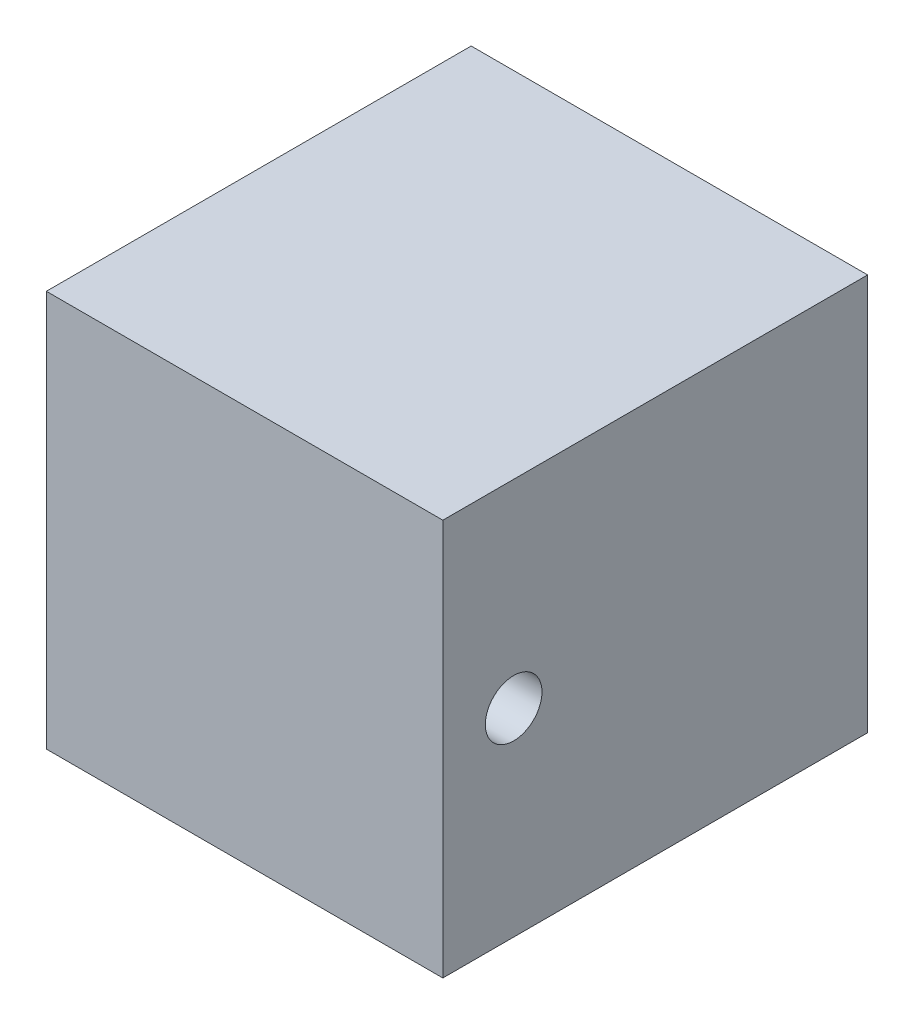
ISO-10303-21;
HEADER;
FILE_DESCRIPTION(('STEP AP214'),'2;1');
FILE_NAME('part.step','',(''),(''),'','','');
FILE_SCHEMA(('AUTOMOTIVE_DESIGN { 1 0 10303 214 1 1 1 1 }'));
ENDSEC;
DATA;
#1=APPLICATION_CONTEXT('core data for automotive mechanical design processes');
#2=APPLICATION_PROTOCOL_DEFINITION('international standard','automotive_design',2000,#1);
#3=PRODUCT_CONTEXT('',#1,'mechanical');
#4=PRODUCT('Part','Part','',(#3));
#5=PRODUCT_RELATED_PRODUCT_CATEGORY('part','',(#4));
#6=PRODUCT_DEFINITION_FORMATION('','',#4);
#7=PRODUCT_DEFINITION_CONTEXT('part definition',#1,'design');
#8=PRODUCT_DEFINITION('design','',#6,#7);
#9=PRODUCT_DEFINITION_SHAPE('','',#8);
#10=(LENGTH_UNIT() NAMED_UNIT(*) SI_UNIT(.MILLI.,.METRE.));
#11=(NAMED_UNIT(*) PLANE_ANGLE_UNIT() SI_UNIT($,.RADIAN.));
#12=(NAMED_UNIT(*) SI_UNIT($,.STERADIAN.) SOLID_ANGLE_UNIT());
#13=UNCERTAINTY_MEASURE_WITH_UNIT(LENGTH_MEASURE(1.E-05),#10,'distance_accuracy_value','');
#14=(GEOMETRIC_REPRESENTATION_CONTEXT(3) GLOBAL_UNCERTAINTY_ASSIGNED_CONTEXT((#13)) GLOBAL_UNIT_ASSIGNED_CONTEXT((#10,
#11,#12)) REPRESENTATION_CONTEXT('',''));
#15=CARTESIAN_POINT('',(0.,0.,0.));
#16=DIRECTION('',(0.,0.,1.));
#17=DIRECTION('',(1.,0.,0.));
#18=AXIS2_PLACEMENT_3D('',#15,#16,#17);
#19=CARTESIAN_POINT('',(0.,0.,0.));
#20=DIRECTION('',(0.,0.,-1.));
#21=DIRECTION('',(-1.,0.,0.));
#22=AXIS2_PLACEMENT_3D('',#19,#20,#21);
#23=PLANE('',#22);
#24=DIRECTION('',(0.,-1.,0.));
#25=VECTOR('',#24,1.);
#26=CARTESIAN_POINT('',(0.,0.,0.));
#27=LINE('',#26,#25);
#28=CARTESIAN_POINT('',(0.,14.,0.));
#29=VERTEX_POINT('',#28);
#30=CARTESIAN_POINT('',(0.,0.,0.));
#31=VERTEX_POINT('',#30);
#32=EDGE_CURVE('E112',#29,#31,#27,.T.);
#33=ORIENTED_EDGE('',*,*,#32,.F.);
#34=DIRECTION('',(-1.,0.,0.));
#35=VECTOR('',#34,1.);
#36=CARTESIAN_POINT('',(0.,14.,0.));
#37=LINE('',#36,#35);
#38=CARTESIAN_POINT('',(14.,14.,0.));
#39=VERTEX_POINT('',#38);
#40=EDGE_CURVE('E63',#39,#29,#37,.T.);
#41=ORIENTED_EDGE('',*,*,#40,.F.);
#42=DIRECTION('',(0.,1.,0.));
#43=VECTOR('',#42,1.);
#44=CARTESIAN_POINT('',(14.,0.,0.));
#45=LINE('',#44,#43);
#46=CARTESIAN_POINT('',(14.,0.,0.));
#47=VERTEX_POINT('',#46);
#48=EDGE_CURVE('E188',#47,#39,#45,.T.);
#49=ORIENTED_EDGE('',*,*,#48,.F.);
#50=DIRECTION('',(1.,0.,0.));
#51=VECTOR('',#50,1.);
#52=CARTESIAN_POINT('',(0.,0.,0.));
#53=LINE('',#52,#51);
#54=EDGE_CURVE('E185',#31,#47,#53,.T.);
#55=ORIENTED_EDGE('',*,*,#54,.F.);
#56=EDGE_LOOP('',(#33,#41,#49,#55));
#57=FACE_BOUND('',#56,.T.);
#58=DIRECTION('',(-1.,0.,0.));
#59=VECTOR('',#58,1.);
#60=CARTESIAN_POINT('',(1.,13.,0.));
#61=LINE('',#60,#59);
#62=CARTESIAN_POINT('',(13.,13.,0.));
#63=VERTEX_POINT('',#62);
#64=CARTESIAN_POINT('',(1.,13.,0.));
#65=VERTEX_POINT('',#64);
#66=EDGE_CURVE('E146',#63,#65,#61,.T.);
#67=ORIENTED_EDGE('',*,*,#66,.T.);
#68=DIRECTION('',(0.,-1.,0.));
#69=VECTOR('',#68,1.);
#70=CARTESIAN_POINT('',(1.,1.,0.));
#71=LINE('',#70,#69);
#72=CARTESIAN_POINT('',(1.,1.,0.));
#73=VERTEX_POINT('',#72);
#74=EDGE_CURVE('E55',#65,#73,#71,.T.);
#75=ORIENTED_EDGE('',*,*,#74,.T.);
#76=DIRECTION('',(1.,0.,0.));
#77=VECTOR('',#76,1.);
#78=CARTESIAN_POINT('',(1.,1.,0.));
#79=LINE('',#78,#77);
#80=CARTESIAN_POINT('',(13.,1.,0.));
#81=VERTEX_POINT('',#80);
#82=EDGE_CURVE('E161',#73,#81,#79,.T.);
#83=ORIENTED_EDGE('',*,*,#82,.T.);
#84=DIRECTION('',(0.,1.,0.));
#85=VECTOR('',#84,1.);
#86=CARTESIAN_POINT('',(13.,1.,0.));
#87=LINE('',#86,#85);
#88=EDGE_CURVE('E165',#81,#63,#87,.T.);
#89=ORIENTED_EDGE('',*,*,#88,.T.);
#90=EDGE_LOOP('',(#67,#75,#83,#89));
#91=FACE_BOUND('',#90,.T.);
#92=ADVANCED_FACE('F39',(#57,#91),#23,.T.);
#93=CARTESIAN_POINT('',(0.,0.,10.));
#94=DIRECTION('',(1.,0.,0.));
#95=DIRECTION('',(0.,0.,-1.));
#96=AXIS2_PLACEMENT_3D('',#93,#94,#95);
#97=PLANE('',#96);
#98=CARTESIAN_POINT('',(0.,7.,12.5));
#99=DIRECTION('',(1.,0.,0.));
#100=DIRECTION('',(0.,0.,-1.));
#101=AXIS2_PLACEMENT_3D('',#98,#99,#100);
#102=CIRCLE('',#101,1.);
#103=CARTESIAN_POINT('',(0.,7.,11.5));
#104=VERTEX_POINT('',#103);
#105=EDGE_CURVE('E129',#104,#104,#102,.T.);
#106=ORIENTED_EDGE('',*,*,#105,.T.);
#107=EDGE_LOOP('',(#106));
#108=FACE_BOUND('',#107,.T.);
#109=ORIENTED_EDGE('',*,*,#32,.T.);
#110=DIRECTION('',(0.,0.,-1.));
#111=VECTOR('',#110,1.);
#112=CARTESIAN_POINT('',(0.,0.,10.));
#113=LINE('',#112,#111);
#114=CARTESIAN_POINT('',(0.,0.,15.));
#115=VERTEX_POINT('',#114);
#116=EDGE_CURVE('E11',#115,#31,#113,.T.);
#117=ORIENTED_EDGE('',*,*,#116,.F.);
#118=DIRECTION('',(0.,-1.,0.));
#119=VECTOR('',#118,1.);
#120=CARTESIAN_POINT('',(0.,14.,15.));
#121=LINE('',#120,#119);
#122=CARTESIAN_POINT('',(0.,14.,15.));
#123=VERTEX_POINT('',#122);
#124=EDGE_CURVE('E110',#123,#115,#121,.T.);
#125=ORIENTED_EDGE('',*,*,#124,.F.);
#126=DIRECTION('',(0.,0.,-1.));
#127=VECTOR('',#126,1.);
#128=CARTESIAN_POINT('',(0.,14.,10.));
#129=LINE('',#128,#127);
#130=EDGE_CURVE('E193',#123,#29,#129,.T.);
#131=ORIENTED_EDGE('',*,*,#130,.T.);
#132=EDGE_LOOP('',(#109,#117,#125,#131));
#133=FACE_BOUND('',#132,.T.);
#134=ADVANCED_FACE('F41',(#108,#133),#97,.F.);
#135=CARTESIAN_POINT('',(0.,0.,10.));
#136=DIRECTION('',(0.,1.,0.));
#137=DIRECTION('',(0.,0.,1.));
#138=AXIS2_PLACEMENT_3D('',#135,#136,#137);
#139=PLANE('',#138);
#140=ORIENTED_EDGE('',*,*,#54,.T.);
#141=DIRECTION('',(0.,0.,-1.));
#142=VECTOR('',#141,1.);
#143=CARTESIAN_POINT('',(14.,0.,10.));
#144=LINE('',#143,#142);
#145=CARTESIAN_POINT('',(14.,0.,15.));
#146=VERTEX_POINT('',#145);
#147=EDGE_CURVE('E48',#146,#47,#144,.T.);
#148=ORIENTED_EDGE('',*,*,#147,.F.);
#149=DIRECTION('',(1.,0.,0.));
#150=VECTOR('',#149,1.);
#151=CARTESIAN_POINT('',(0.,0.,15.));
#152=LINE('',#151,#150);
#153=EDGE_CURVE('E115',#115,#146,#152,.T.);
#154=ORIENTED_EDGE('',*,*,#153,.F.);
#155=ORIENTED_EDGE('',*,*,#116,.T.);
#156=EDGE_LOOP('',(#140,#148,#154,#155));
#157=FACE_BOUND('',#156,.T.);
#158=ADVANCED_FACE('F116',(#157),#139,.F.);
#159=CARTESIAN_POINT('',(14.,0.,10.));
#160=DIRECTION('',(-1.,0.,0.));
#161=DIRECTION('',(0.,0.,1.));
#162=AXIS2_PLACEMENT_3D('',#159,#160,#161);
#163=PLANE('',#162);
#164=CARTESIAN_POINT('',(14.,7.,12.5));
#165=DIRECTION('',(1.,0.,0.));
#166=DIRECTION('',(0.,0.,-1.));
#167=AXIS2_PLACEMENT_3D('',#164,#165,#166);
#168=CIRCLE('',#167,1.);
#169=CARTESIAN_POINT('',(14.,7.,11.5));
#170=VERTEX_POINT('',#169);
#171=EDGE_CURVE('E133',#170,#170,#168,.T.);
#172=ORIENTED_EDGE('',*,*,#171,.F.);
#173=EDGE_LOOP('',(#172));
#174=FACE_BOUND('',#173,.T.);
#175=ORIENTED_EDGE('',*,*,#48,.T.);
#176=DIRECTION('',(0.,0.,-1.));
#177=VECTOR('',#176,1.);
#178=CARTESIAN_POINT('',(14.,14.,10.));
#179=LINE('',#178,#177);
#180=CARTESIAN_POINT('',(14.,14.,15.));
#181=VERTEX_POINT('',#180);
#182=EDGE_CURVE('E196',#181,#39,#179,.T.);
#183=ORIENTED_EDGE('',*,*,#182,.F.);
#184=DIRECTION('',(0.,1.,0.));
#185=VECTOR('',#184,1.);
#186=CARTESIAN_POINT('',(14.,14.,15.));
#187=LINE('',#186,#185);
#188=EDGE_CURVE('E122',#146,#181,#187,.T.);
#189=ORIENTED_EDGE('',*,*,#188,.F.);
#190=ORIENTED_EDGE('',*,*,#147,.T.);
#191=EDGE_LOOP('',(#175,#183,#189,#190));
#192=FACE_BOUND('',#191,.T.);
#193=ADVANCED_FACE('F201',(#174,#192),#163,.F.);
#194=CARTESIAN_POINT('',(0.,14.,10.));
#195=DIRECTION('',(0.,-1.,0.));
#196=DIRECTION('',(0.,0.,-1.));
#197=AXIS2_PLACEMENT_3D('',#194,#195,#196);
#198=PLANE('',#197);
#199=ORIENTED_EDGE('',*,*,#40,.T.);
#200=ORIENTED_EDGE('',*,*,#130,.F.);
#201=DIRECTION('',(-1.,0.,0.));
#202=VECTOR('',#201,1.);
#203=CARTESIAN_POINT('',(0.,14.,15.));
#204=LINE('',#203,#202);
#205=EDGE_CURVE('E127',#181,#123,#204,.T.);
#206=ORIENTED_EDGE('',*,*,#205,.F.);
#207=ORIENTED_EDGE('',*,*,#182,.T.);
#208=EDGE_LOOP('',(#199,#200,#206,#207));
#209=FACE_BOUND('',#208,.T.);
#210=ADVANCED_FACE('F236',(#209),#198,.F.);
#211=CARTESIAN_POINT('',(1.,1.,10.));
#212=DIRECTION('',(1.,0.,0.));
#213=DIRECTION('',(0.,0.,-1.));
#214=AXIS2_PLACEMENT_3D('',#211,#212,#213);
#215=PLANE('',#214);
#216=ORIENTED_EDGE('',*,*,#74,.F.);
#217=DIRECTION('',(0.,0.,-1.));
#218=VECTOR('',#217,1.);
#219=CARTESIAN_POINT('',(1.,13.,10.));
#220=LINE('',#219,#218);
#221=CARTESIAN_POINT('',(1.,13.,10.));
#222=VERTEX_POINT('',#221);
#223=EDGE_CURVE('E158',#222,#65,#220,.T.);
#224=ORIENTED_EDGE('',*,*,#223,.F.);
#225=DIRECTION('',(0.,-1.,0.));
#226=VECTOR('',#225,1.);
#227=CARTESIAN_POINT('',(1.,1.,10.));
#228=LINE('',#227,#226);
#229=CARTESIAN_POINT('',(1.,1.,10.));
#230=VERTEX_POINT('',#229);
#231=EDGE_CURVE('E141',#222,#230,#228,.T.);
#232=ORIENTED_EDGE('',*,*,#231,.T.);
#233=DIRECTION('',(0.,0.,-1.));
#234=VECTOR('',#233,1.);
#235=CARTESIAN_POINT('',(1.,1.,10.));
#236=LINE('',#235,#234);
#237=EDGE_CURVE('E180',#230,#73,#236,.T.);
#238=ORIENTED_EDGE('',*,*,#237,.T.);
#239=EDGE_LOOP('',(#216,#224,#232,#238));
#240=FACE_BOUND('',#239,.T.);
#241=ADVANCED_FACE('F211',(#240),#215,.T.);
#242=CARTESIAN_POINT('',(1.,1.,10.));
#243=DIRECTION('',(0.,1.,0.));
#244=DIRECTION('',(0.,0.,1.));
#245=AXIS2_PLACEMENT_3D('',#242,#243,#244);
#246=PLANE('',#245);
#247=ORIENTED_EDGE('',*,*,#82,.F.);
#248=ORIENTED_EDGE('',*,*,#237,.F.);
#249=DIRECTION('',(1.,0.,0.));
#250=VECTOR('',#249,1.);
#251=CARTESIAN_POINT('',(1.,1.,10.));
#252=LINE('',#251,#250);
#253=CARTESIAN_POINT('',(13.,1.,10.));
#254=VERTEX_POINT('',#253);
#255=EDGE_CURVE('E145',#230,#254,#252,.T.);
#256=ORIENTED_EDGE('',*,*,#255,.T.);
#257=DIRECTION('',(0.,0.,-1.));
#258=VECTOR('',#257,1.);
#259=CARTESIAN_POINT('',(13.,1.,10.));
#260=LINE('',#259,#258);
#261=EDGE_CURVE('E177',#254,#81,#260,.T.);
#262=ORIENTED_EDGE('',*,*,#261,.T.);
#263=EDGE_LOOP('',(#247,#248,#256,#262));
#264=FACE_BOUND('',#263,.T.);
#265=ADVANCED_FACE('F215',(#264),#246,.T.);
#266=CARTESIAN_POINT('',(13.,1.,10.));
#267=DIRECTION('',(-1.,0.,0.));
#268=DIRECTION('',(0.,-1.,0.));
#269=AXIS2_PLACEMENT_3D('',#266,#267,#268);
#270=PLANE('',#269);
#271=ORIENTED_EDGE('',*,*,#88,.F.);
#272=ORIENTED_EDGE('',*,*,#261,.F.);
#273=DIRECTION('',(0.,1.,0.));
#274=VECTOR('',#273,1.);
#275=CARTESIAN_POINT('',(13.,1.,10.));
#276=LINE('',#275,#274);
#277=CARTESIAN_POINT('',(13.,13.,10.));
#278=VERTEX_POINT('',#277);
#279=EDGE_CURVE('E150',#254,#278,#276,.T.);
#280=ORIENTED_EDGE('',*,*,#279,.T.);
#281=DIRECTION('',(0.,0.,-1.));
#282=VECTOR('',#281,1.);
#283=CARTESIAN_POINT('',(13.,13.,10.));
#284=LINE('',#283,#282);
#285=EDGE_CURVE('E174',#278,#63,#284,.T.);
#286=ORIENTED_EDGE('',*,*,#285,.T.);
#287=EDGE_LOOP('',(#271,#272,#280,#286));
#288=FACE_BOUND('',#287,.T.);
#289=ADVANCED_FACE('F218',(#288),#270,.T.);
#290=CARTESIAN_POINT('',(1.,13.,10.));
#291=DIRECTION('',(0.,-1.,0.));
#292=DIRECTION('',(0.,0.,-1.));
#293=AXIS2_PLACEMENT_3D('',#290,#291,#292);
#294=PLANE('',#293);
#295=ORIENTED_EDGE('',*,*,#66,.F.);
#296=ORIENTED_EDGE('',*,*,#285,.F.);
#297=DIRECTION('',(-1.,0.,0.));
#298=VECTOR('',#297,1.);
#299=CARTESIAN_POINT('',(1.,13.,10.));
#300=LINE('',#299,#298);
#301=EDGE_CURVE('E154',#278,#222,#300,.T.);
#302=ORIENTED_EDGE('',*,*,#301,.T.);
#303=ORIENTED_EDGE('',*,*,#223,.T.);
#304=EDGE_LOOP('',(#295,#296,#302,#303));
#305=FACE_BOUND('',#304,.T.);
#306=ADVANCED_FACE('F210',(#305),#294,.T.);
#307=CARTESIAN_POINT('',(0.,0.,10.));
#308=DIRECTION('',(0.,0.,1.));
#309=DIRECTION('',(1.,0.,0.));
#310=AXIS2_PLACEMENT_3D('',#307,#308,#309);
#311=PLANE('',#310);
#312=ORIENTED_EDGE('',*,*,#231,.F.);
#313=ORIENTED_EDGE('',*,*,#301,.F.);
#314=ORIENTED_EDGE('',*,*,#279,.F.);
#315=ORIENTED_EDGE('',*,*,#255,.F.);
#316=EDGE_LOOP('',(#312,#313,#314,#315));
#317=FACE_BOUND('',#316,.T.);
#318=ADVANCED_FACE('F219',(#317),#311,.F.);
#319=CARTESIAN_POINT('',(0.,0.,15.));
#320=DIRECTION('',(0.,0.,1.));
#321=DIRECTION('',(1.,0.,0.));
#322=AXIS2_PLACEMENT_3D('',#319,#320,#321);
#323=PLANE('',#322);
#324=ORIENTED_EDGE('',*,*,#124,.T.);
#325=ORIENTED_EDGE('',*,*,#153,.T.);
#326=ORIENTED_EDGE('',*,*,#188,.T.);
#327=ORIENTED_EDGE('',*,*,#205,.T.);
#328=EDGE_LOOP('',(#324,#325,#326,#327));
#329=FACE_BOUND('',#328,.T.);
#330=ADVANCED_FACE('F125',(#329),#323,.T.);
#331=CARTESIAN_POINT('',(0.,7.,12.5));
#332=DIRECTION('',(1.,0.,0.));
#333=DIRECTION('',(0.,0.,-1.));
#334=AXIS2_PLACEMENT_3D('',#331,#332,#333);
#335=CYLINDRICAL_SURFACE('',#334,1.);
#336=ORIENTED_EDGE('',*,*,#105,.F.);
#337=EDGE_LOOP('',(#336));
#338=FACE_BOUND('',#337,.T.);
#339=ORIENTED_EDGE('',*,*,#171,.T.);
#340=EDGE_LOOP('',(#339));
#341=FACE_BOUND('',#340,.T.);
#342=ADVANCED_FACE('F226',(#338,#341),#335,.F.);
#343=CLOSED_SHELL('',(#92,#134,#158,#193,#210,#241,#265,#289,#306,#318,#330,#342));
#344=MANIFOLD_SOLID_BREP('B2',#343);
#345=ADVANCED_BREP_SHAPE_REPRESENTATION('',(#18,#344),#14);
#346=SHAPE_DEFINITION_REPRESENTATION(#9,#345);
ENDSEC;
END-ISO-10303-21;
